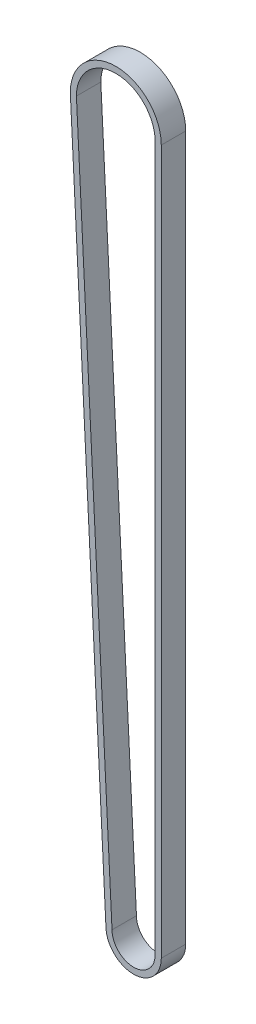
ISO-10303-21;
HEADER;
FILE_DESCRIPTION(('STEP AP214'),'2;1');
FILE_NAME('part.step','',(''),(''),'','','');
FILE_SCHEMA(('AUTOMOTIVE_DESIGN { 1 0 10303 214 1 1 1 1 }'));
ENDSEC;
DATA;
#1=APPLICATION_CONTEXT('core data for automotive mechanical design processes');
#2=APPLICATION_PROTOCOL_DEFINITION('international standard','automotive_design',2000,#1);
#3=PRODUCT_CONTEXT('',#1,'mechanical');
#4=PRODUCT('Part','Part','',(#3));
#5=PRODUCT_RELATED_PRODUCT_CATEGORY('part','',(#4));
#6=PRODUCT_DEFINITION_FORMATION('','',#4);
#7=PRODUCT_DEFINITION_CONTEXT('part definition',#1,'design');
#8=PRODUCT_DEFINITION('design','',#6,#7);
#9=PRODUCT_DEFINITION_SHAPE('','',#8);
#10=(LENGTH_UNIT() NAMED_UNIT(*) SI_UNIT(.MILLI.,.METRE.));
#11=(NAMED_UNIT(*) PLANE_ANGLE_UNIT() SI_UNIT($,.RADIAN.));
#12=(NAMED_UNIT(*) SI_UNIT($,.STERADIAN.) SOLID_ANGLE_UNIT());
#13=UNCERTAINTY_MEASURE_WITH_UNIT(LENGTH_MEASURE(1.E-05),#10,'distance_accuracy_value','');
#14=(GEOMETRIC_REPRESENTATION_CONTEXT(3) GLOBAL_UNCERTAINTY_ASSIGNED_CONTEXT((#13)) GLOBAL_UNIT_ASSIGNED_CONTEXT((#10,
#11,#12)) REPRESENTATION_CONTEXT('',''));
#15=CARTESIAN_POINT('',(0.,0.,0.));
#16=DIRECTION('',(0.,0.,1.));
#17=DIRECTION('',(1.,0.,0.));
#18=AXIS2_PLACEMENT_3D('',#15,#16,#17);
#19=CARTESIAN_POINT('',(-5.63329551619588,47.6401740369854,6.));
#20=DIRECTION('',(0.,0.,1.));
#21=DIRECTION('',(1.,0.,0.));
#22=AXIS2_PLACEMENT_3D('',#19,#20,#21);
#23=PLANE('',#22);
#24=CARTESIAN_POINT('',(-5.63329551619588,47.6401740369854,6.));
#25=DIRECTION('',(0.,0.,1.));
#26=DIRECTION('',(1.,0.,0.));
#27=AXIS2_PLACEMENT_3D('',#24,#25,#26);
#28=CIRCLE('',#27,11.175);
#29=CARTESIAN_POINT('',(5.54170448380412,47.6401740369854,6.));
#30=VERTEX_POINT('',#29);
#31=CARTESIAN_POINT('',(-16.8082955161959,47.6401740369854,6.));
#32=VERTEX_POINT('',#31);
#33=EDGE_CURVE('E132',#30,#32,#28,.T.);
#34=ORIENTED_EDGE('',*,*,#33,.T.);
#35=DIRECTION('',(0.0505134657519289,-0.998723380009564,0.));
#36=VECTOR('',#35,1.);
#37=CARTESIAN_POINT('',(-16.8082955161959,47.6401740369854,6.));
#38=LINE('',#37,#36);
#39=CARTESIAN_POINT('',(-8.05829551619586,-125.359825963015,6.));
#40=VERTEX_POINT('',#39);
#41=EDGE_CURVE('E135',#32,#40,#38,.T.);
#42=ORIENTED_EDGE('',*,*,#41,.T.);
#43=CARTESIAN_POINT('',(-1.25829551619586,-125.359825963015,6.));
#44=DIRECTION('',(0.,0.,1.));
#45=DIRECTION('',(1.,0.,0.));
#46=AXIS2_PLACEMENT_3D('',#43,#44,#45);
#47=CIRCLE('',#46,6.8);
#48=CARTESIAN_POINT('',(5.54170448380414,-125.359825963015,6.));
#49=VERTEX_POINT('',#48);
#50=EDGE_CURVE('E138',#40,#49,#47,.T.);
#51=ORIENTED_EDGE('',*,*,#50,.T.);
#52=DIRECTION('',(0.,1.,0.));
#53=VECTOR('',#52,1.);
#54=CARTESIAN_POINT('',(5.54170448380412,47.6401740369854,6.));
#55=LINE('',#54,#53);
#56=EDGE_CURVE('E140',#49,#30,#55,.T.);
#57=ORIENTED_EDGE('',*,*,#56,.T.);
#58=EDGE_LOOP('',(#34,#42,#51,#57));
#59=FACE_BOUND('',#58,.T.);
#60=DIRECTION('',(0.050513465751929,-0.998723380009564,0.));
#61=VECTOR('',#60,1.);
#62=CARTESIAN_POINT('',(-15.3082955161959,47.6401740369854,6.));
#63=LINE('',#62,#61);
#64=CARTESIAN_POINT('',(-15.3082955161959,47.6401740369854,6.));
#65=VERTEX_POINT('',#64);
#66=CARTESIAN_POINT('',(-6.55829551619586,-125.359825963015,6.));
#67=VERTEX_POINT('',#66);
#68=EDGE_CURVE('E104',#65,#67,#63,.T.);
#69=ORIENTED_EDGE('',*,*,#68,.F.);
#70=CARTESIAN_POINT('',(-5.63329551619588,47.6401740369854,6.));
#71=DIRECTION('',(0.,0.,1.));
#72=DIRECTION('',(1.,0.,0.));
#73=AXIS2_PLACEMENT_3D('',#70,#71,#72);
#74=CIRCLE('',#73,9.675);
#75=CARTESIAN_POINT('',(4.04170448380412,47.6401740369854,6.));
#76=VERTEX_POINT('',#75);
#77=EDGE_CURVE('E96',#76,#65,#74,.T.);
#78=ORIENTED_EDGE('',*,*,#77,.F.);
#79=DIRECTION('',(0.,1.,0.));
#80=VECTOR('',#79,1.);
#81=CARTESIAN_POINT('',(4.04170448380412,47.6401740369854,6.));
#82=LINE('',#81,#80);
#83=CARTESIAN_POINT('',(4.04170448380414,-125.359825963015,6.));
#84=VERTEX_POINT('',#83);
#85=EDGE_CURVE('E118',#84,#76,#82,.T.);
#86=ORIENTED_EDGE('',*,*,#85,.F.);
#87=CARTESIAN_POINT('',(-1.25829551619586,-125.359825963015,6.));
#88=DIRECTION('',(0.,0.,1.));
#89=DIRECTION('',(1.,0.,0.));
#90=AXIS2_PLACEMENT_3D('',#87,#88,#89);
#91=CIRCLE('',#90,5.3);
#92=EDGE_CURVE('E116',#67,#84,#91,.T.);
#93=ORIENTED_EDGE('',*,*,#92,.F.);
#94=EDGE_LOOP('',(#69,#78,#86,#93));
#95=FACE_BOUND('',#94,.T.);
#96=ADVANCED_FACE('F31',(#59,#95),#23,.T.);
#97=CARTESIAN_POINT('',(-5.63329551619588,47.6401740369854,0.));
#98=DIRECTION('',(0.,0.,1.));
#99=DIRECTION('',(1.,0.,0.));
#100=AXIS2_PLACEMENT_3D('',#97,#98,#99);
#101=PLANE('',#100);
#102=CARTESIAN_POINT('',(-5.63329551619588,47.6401740369854,0.));
#103=DIRECTION('',(0.,0.,1.));
#104=DIRECTION('',(1.,0.,0.));
#105=AXIS2_PLACEMENT_3D('',#102,#103,#104);
#106=CIRCLE('',#105,11.175);
#107=CARTESIAN_POINT('',(5.54170448380412,47.6401740369854,0.));
#108=VERTEX_POINT('',#107);
#109=CARTESIAN_POINT('',(-16.8082955161959,47.6401740369854,0.));
#110=VERTEX_POINT('',#109);
#111=EDGE_CURVE('E112',#108,#110,#106,.T.);
#112=ORIENTED_EDGE('',*,*,#111,.F.);
#113=DIRECTION('',(0.,1.,0.));
#114=VECTOR('',#113,1.);
#115=CARTESIAN_POINT('',(5.54170448380412,47.6401740369854,0.));
#116=LINE('',#115,#114);
#117=CARTESIAN_POINT('',(5.54170448380414,-125.359825963015,0.));
#118=VERTEX_POINT('',#117);
#119=EDGE_CURVE('E136',#118,#108,#116,.T.);
#120=ORIENTED_EDGE('',*,*,#119,.F.);
#121=CARTESIAN_POINT('',(-1.25829551619586,-125.359825963015,0.));
#122=DIRECTION('',(0.,0.,1.));
#123=DIRECTION('',(1.,0.,0.));
#124=AXIS2_PLACEMENT_3D('',#121,#122,#123);
#125=CIRCLE('',#124,6.8);
#126=CARTESIAN_POINT('',(-8.05829551619586,-125.359825963015,0.));
#127=VERTEX_POINT('',#126);
#128=EDGE_CURVE('E147',#127,#118,#125,.T.);
#129=ORIENTED_EDGE('',*,*,#128,.F.);
#130=DIRECTION('',(0.0505134657519289,-0.998723380009564,0.));
#131=VECTOR('',#130,1.);
#132=CARTESIAN_POINT('',(-16.8082955161959,47.6401740369854,0.));
#133=LINE('',#132,#131);
#134=EDGE_CURVE('E145',#110,#127,#133,.T.);
#135=ORIENTED_EDGE('',*,*,#134,.F.);
#136=EDGE_LOOP('',(#112,#120,#129,#135));
#137=FACE_BOUND('',#136,.T.);
#138=CARTESIAN_POINT('',(-5.63329551619588,47.6401740369854,0.));
#139=DIRECTION('',(0.,0.,1.));
#140=DIRECTION('',(1.,0.,0.));
#141=AXIS2_PLACEMENT_3D('',#138,#139,#140);
#142=CIRCLE('',#141,9.675);
#143=CARTESIAN_POINT('',(4.04170448380412,47.6401740369854,0.));
#144=VERTEX_POINT('',#143);
#145=CARTESIAN_POINT('',(-15.3082955161959,47.6401740369854,0.));
#146=VERTEX_POINT('',#145);
#147=EDGE_CURVE('E54',#144,#146,#142,.T.);
#148=ORIENTED_EDGE('',*,*,#147,.T.);
#149=DIRECTION('',(0.050513465751929,-0.998723380009564,0.));
#150=VECTOR('',#149,1.);
#151=CARTESIAN_POINT('',(-15.3082955161959,47.6401740369854,0.));
#152=LINE('',#151,#150);
#153=CARTESIAN_POINT('',(-6.55829551619586,-125.359825963015,0.));
#154=VERTEX_POINT('',#153);
#155=EDGE_CURVE('E111',#146,#154,#152,.T.);
#156=ORIENTED_EDGE('',*,*,#155,.T.);
#157=CARTESIAN_POINT('',(-1.25829551619586,-125.359825963015,0.));
#158=DIRECTION('',(0.,0.,1.));
#159=DIRECTION('',(1.,0.,0.));
#160=AXIS2_PLACEMENT_3D('',#157,#158,#159);
#161=CIRCLE('',#160,5.3);
#162=CARTESIAN_POINT('',(4.04170448380414,-125.359825963015,0.));
#163=VERTEX_POINT('',#162);
#164=EDGE_CURVE('E124',#154,#163,#161,.T.);
#165=ORIENTED_EDGE('',*,*,#164,.T.);
#166=DIRECTION('',(0.,1.,0.));
#167=VECTOR('',#166,1.);
#168=CARTESIAN_POINT('',(4.04170448380412,47.6401740369854,0.));
#169=LINE('',#168,#167);
#170=EDGE_CURVE('E105',#163,#144,#169,.T.);
#171=ORIENTED_EDGE('',*,*,#170,.T.);
#172=EDGE_LOOP('',(#148,#156,#165,#171));
#173=FACE_BOUND('',#172,.T.);
#174=ADVANCED_FACE('F165',(#137,#173),#101,.F.);
#175=CARTESIAN_POINT('',(-5.63329551619588,47.6401740369854,6.));
#176=DIRECTION('',(0.,0.,-1.));
#177=DIRECTION('',(-1.,0.,0.));
#178=AXIS2_PLACEMENT_3D('',#175,#176,#177);
#179=CYLINDRICAL_SURFACE('',#178,11.175);
#180=ORIENTED_EDGE('',*,*,#111,.T.);
#181=DIRECTION('',(0.,0.,-1.));
#182=VECTOR('',#181,1.);
#183=CARTESIAN_POINT('',(-16.8082955161959,47.6401740369854,6.));
#184=LINE('',#183,#182);
#185=EDGE_CURVE('E11',#32,#110,#184,.T.);
#186=ORIENTED_EDGE('',*,*,#185,.F.);
#187=ORIENTED_EDGE('',*,*,#33,.F.);
#188=DIRECTION('',(0.,0.,-1.));
#189=VECTOR('',#188,1.);
#190=CARTESIAN_POINT('',(5.54170448380412,47.6401740369854,6.));
#191=LINE('',#190,#189);
#192=EDGE_CURVE('E142',#30,#108,#191,.T.);
#193=ORIENTED_EDGE('',*,*,#192,.T.);
#194=EDGE_LOOP('',(#180,#186,#187,#193));
#195=FACE_BOUND('',#194,.T.);
#196=ADVANCED_FACE('F33',(#195),#179,.T.);
#197=CARTESIAN_POINT('',(-16.8082955161959,47.6401740369854,6.));
#198=DIRECTION('',(0.998723380009564,0.0505134657519289,0.));
#199=DIRECTION('',(-0.050513465751929,0.998723380009564,0.));
#200=AXIS2_PLACEMENT_3D('',#197,#198,#199);
#201=PLANE('',#200);
#202=ORIENTED_EDGE('',*,*,#134,.T.);
#203=DIRECTION('',(0.,0.,-1.));
#204=VECTOR('',#203,1.);
#205=CARTESIAN_POINT('',(-8.05829551619586,-125.359825963015,6.));
#206=LINE('',#205,#204);
#207=EDGE_CURVE('E39',#40,#127,#206,.T.);
#208=ORIENTED_EDGE('',*,*,#207,.F.);
#209=ORIENTED_EDGE('',*,*,#41,.F.);
#210=ORIENTED_EDGE('',*,*,#185,.T.);
#211=EDGE_LOOP('',(#202,#208,#209,#210));
#212=FACE_BOUND('',#211,.T.);
#213=ADVANCED_FACE('F175',(#212),#201,.F.);
#214=CARTESIAN_POINT('',(-1.25829551619586,-125.359825963015,6.));
#215=DIRECTION('',(0.,0.,-1.));
#216=DIRECTION('',(-1.,0.,0.));
#217=AXIS2_PLACEMENT_3D('',#214,#215,#216);
#218=CYLINDRICAL_SURFACE('',#217,6.8);
#219=ORIENTED_EDGE('',*,*,#128,.T.);
#220=DIRECTION('',(0.,0.,-1.));
#221=VECTOR('',#220,1.);
#222=CARTESIAN_POINT('',(5.54170448380414,-125.359825963015,6.));
#223=LINE('',#222,#221);
#224=EDGE_CURVE('E152',#49,#118,#223,.T.);
#225=ORIENTED_EDGE('',*,*,#224,.F.);
#226=ORIENTED_EDGE('',*,*,#50,.F.);
#227=ORIENTED_EDGE('',*,*,#207,.T.);
#228=EDGE_LOOP('',(#219,#225,#226,#227));
#229=FACE_BOUND('',#228,.T.);
#230=ADVANCED_FACE('F159',(#229),#218,.T.);
#231=CARTESIAN_POINT('',(5.54170448380412,47.6401740369854,6.));
#232=DIRECTION('',(-1.,0.,0.));
#233=DIRECTION('',(0.,-1.,0.));
#234=AXIS2_PLACEMENT_3D('',#231,#232,#233);
#235=PLANE('',#234);
#236=ORIENTED_EDGE('',*,*,#119,.T.);
#237=ORIENTED_EDGE('',*,*,#192,.F.);
#238=ORIENTED_EDGE('',*,*,#56,.F.);
#239=ORIENTED_EDGE('',*,*,#224,.T.);
#240=EDGE_LOOP('',(#236,#237,#238,#239));
#241=FACE_BOUND('',#240,.T.);
#242=ADVANCED_FACE('F169',(#241),#235,.F.);
#243=CARTESIAN_POINT('',(-5.63329551619588,47.6401740369854,6.));
#244=DIRECTION('',(0.,0.,-1.));
#245=DIRECTION('',(-1.,0.,0.));
#246=AXIS2_PLACEMENT_3D('',#243,#244,#245);
#247=CYLINDRICAL_SURFACE('',#246,9.675);
#248=ORIENTED_EDGE('',*,*,#147,.F.);
#249=DIRECTION('',(0.,0.,-1.));
#250=VECTOR('',#249,1.);
#251=CARTESIAN_POINT('',(4.04170448380412,47.6401740369854,6.));
#252=LINE('',#251,#250);
#253=EDGE_CURVE('E100',#76,#144,#252,.T.);
#254=ORIENTED_EDGE('',*,*,#253,.F.);
#255=ORIENTED_EDGE('',*,*,#77,.T.);
#256=DIRECTION('',(0.,0.,-1.));
#257=VECTOR('',#256,1.);
#258=CARTESIAN_POINT('',(-15.3082955161959,47.6401740369854,6.));
#259=LINE('',#258,#257);
#260=EDGE_CURVE('E99',#65,#146,#259,.T.);
#261=ORIENTED_EDGE('',*,*,#260,.T.);
#262=EDGE_LOOP('',(#248,#254,#255,#261));
#263=FACE_BOUND('',#262,.T.);
#264=ADVANCED_FACE('F98',(#263),#247,.F.);
#265=CARTESIAN_POINT('',(-15.3082955161959,47.6401740369854,6.));
#266=DIRECTION('',(0.998723380009564,0.050513465751929,0.));
#267=DIRECTION('',(-0.050513465751929,0.998723380009564,0.));
#268=AXIS2_PLACEMENT_3D('',#265,#266,#267);
#269=PLANE('',#268);
#270=ORIENTED_EDGE('',*,*,#155,.F.);
#271=ORIENTED_EDGE('',*,*,#260,.F.);
#272=ORIENTED_EDGE('',*,*,#68,.T.);
#273=DIRECTION('',(0.,0.,-1.));
#274=VECTOR('',#273,1.);
#275=CARTESIAN_POINT('',(-6.55829551619586,-125.359825963015,6.));
#276=LINE('',#275,#274);
#277=EDGE_CURVE('E113',#67,#154,#276,.T.);
#278=ORIENTED_EDGE('',*,*,#277,.T.);
#279=EDGE_LOOP('',(#270,#271,#272,#278));
#280=FACE_BOUND('',#279,.T.);
#281=ADVANCED_FACE('F108',(#280),#269,.T.);
#282=CARTESIAN_POINT('',(-1.25829551619586,-125.359825963015,6.));
#283=DIRECTION('',(0.,0.,-1.));
#284=DIRECTION('',(-1.,0.,0.));
#285=AXIS2_PLACEMENT_3D('',#282,#283,#284);
#286=CYLINDRICAL_SURFACE('',#285,5.3);
#287=ORIENTED_EDGE('',*,*,#164,.F.);
#288=ORIENTED_EDGE('',*,*,#277,.F.);
#289=ORIENTED_EDGE('',*,*,#92,.T.);
#290=DIRECTION('',(0.,0.,-1.));
#291=VECTOR('',#290,1.);
#292=CARTESIAN_POINT('',(4.04170448380414,-125.359825963015,6.));
#293=LINE('',#292,#291);
#294=EDGE_CURVE('E46',#84,#163,#293,.T.);
#295=ORIENTED_EDGE('',*,*,#294,.T.);
#296=EDGE_LOOP('',(#287,#288,#289,#295));
#297=FACE_BOUND('',#296,.T.);
#298=ADVANCED_FACE('F198',(#297),#286,.F.);
#299=CARTESIAN_POINT('',(4.04170448380412,47.6401740369854,6.));
#300=DIRECTION('',(-1.,0.,0.));
#301=DIRECTION('',(0.,-1.,0.));
#302=AXIS2_PLACEMENT_3D('',#299,#300,#301);
#303=PLANE('',#302);
#304=ORIENTED_EDGE('',*,*,#170,.F.);
#305=ORIENTED_EDGE('',*,*,#294,.F.);
#306=ORIENTED_EDGE('',*,*,#85,.T.);
#307=ORIENTED_EDGE('',*,*,#253,.T.);
#308=EDGE_LOOP('',(#304,#305,#306,#307));
#309=FACE_BOUND('',#308,.T.);
#310=ADVANCED_FACE('F202',(#309),#303,.T.);
#311=CLOSED_SHELL('',(#96,#174,#196,#213,#230,#242,#264,#281,#298,#310));
#312=MANIFOLD_SOLID_BREP('B2',#311);
#313=ADVANCED_BREP_SHAPE_REPRESENTATION('',(#18,#312),#14);
#314=SHAPE_DEFINITION_REPRESENTATION(#9,#313);
ENDSEC;
END-ISO-10303-21;
